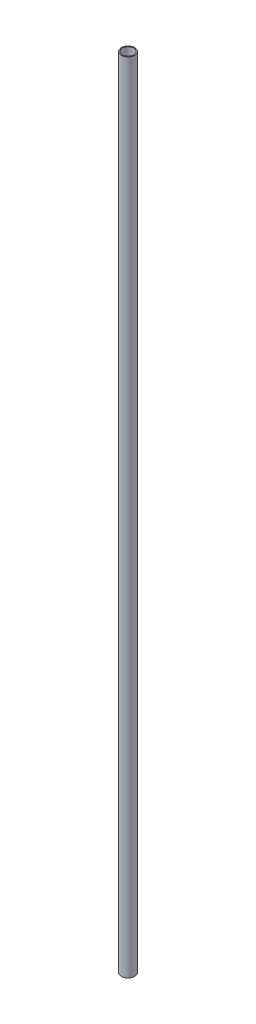
ISO-10303-21;
HEADER;
FILE_DESCRIPTION(('STEP AP214'),'2;1');
FILE_NAME('part.step','',(''),(''),'','','');
FILE_SCHEMA(('AUTOMOTIVE_DESIGN { 1 0 10303 214 1 1 1 1 }'));
ENDSEC;
DATA;
#1=APPLICATION_CONTEXT('core data for automotive mechanical design processes');
#2=APPLICATION_PROTOCOL_DEFINITION('international standard','automotive_design',2000,#1);
#3=PRODUCT_CONTEXT('',#1,'mechanical');
#4=PRODUCT('Part','Part','',(#3));
#5=PRODUCT_RELATED_PRODUCT_CATEGORY('part','',(#4));
#6=PRODUCT_DEFINITION_FORMATION('','',#4);
#7=PRODUCT_DEFINITION_CONTEXT('part definition',#1,'design');
#8=PRODUCT_DEFINITION('design','',#6,#7);
#9=PRODUCT_DEFINITION_SHAPE('','',#8);
#10=(LENGTH_UNIT() NAMED_UNIT(*) SI_UNIT(.MILLI.,.METRE.));
#11=(NAMED_UNIT(*) PLANE_ANGLE_UNIT() SI_UNIT($,.RADIAN.));
#12=(NAMED_UNIT(*) SI_UNIT($,.STERADIAN.) SOLID_ANGLE_UNIT());
#13=UNCERTAINTY_MEASURE_WITH_UNIT(LENGTH_MEASURE(1.E-05),#10,'distance_accuracy_value','');
#14=(GEOMETRIC_REPRESENTATION_CONTEXT(3) GLOBAL_UNCERTAINTY_ASSIGNED_CONTEXT((#13)) GLOBAL_UNIT_ASSIGNED_CONTEXT((#10,
#11,#12)) REPRESENTATION_CONTEXT('',''));
#15=CARTESIAN_POINT('',(0.,0.,0.));
#16=DIRECTION('',(0.,0.,1.));
#17=DIRECTION('',(1.,0.,0.));
#18=AXIS2_PLACEMENT_3D('',#15,#16,#17);
#19=CARTESIAN_POINT('',(0.,-890.,0.));
#20=DIRECTION('',(0.,1.,0.));
#21=DIRECTION('',(0.,0.,1.));
#22=AXIS2_PLACEMENT_3D('',#19,#20,#21);
#23=CYLINDRICAL_SURFACE('',#22,7.5);
#24=CARTESIAN_POINT('',(0.,-890.,0.));
#25=DIRECTION('',(0.,1.,0.));
#26=DIRECTION('',(0.,0.,1.));
#27=AXIS2_PLACEMENT_3D('',#24,#25,#26);
#28=CIRCLE('',#27,7.5);
#29=CARTESIAN_POINT('',(0.,-890.,7.5));
#30=VERTEX_POINT('',#29);
#31=EDGE_CURVE('E10',#30,#30,#28,.T.);
#32=ORIENTED_EDGE('',*,*,#31,.T.);
#33=EDGE_LOOP('',(#32));
#34=FACE_BOUND('',#33,.T.);
#35=CARTESIAN_POINT('',(0.,0.,0.));
#36=DIRECTION('',(0.,1.,0.));
#37=DIRECTION('',(0.,0.,1.));
#38=AXIS2_PLACEMENT_3D('',#35,#36,#37);
#39=CIRCLE('',#38,7.5);
#40=CARTESIAN_POINT('',(0.,0.,7.5));
#41=VERTEX_POINT('',#40);
#42=EDGE_CURVE('E44',#41,#41,#39,.T.);
#43=ORIENTED_EDGE('',*,*,#42,.F.);
#44=EDGE_LOOP('',(#43));
#45=FACE_BOUND('',#44,.T.);
#46=ADVANCED_FACE('F41',(#34,#45),#23,.T.);
#47=CARTESIAN_POINT('',(0.,-890.,0.));
#48=DIRECTION('',(0.,1.,0.));
#49=DIRECTION('',(0.,0.,1.));
#50=AXIS2_PLACEMENT_3D('',#47,#48,#49);
#51=PLANE('',#50);
#52=CARTESIAN_POINT('',(0.,-890.,0.));
#53=DIRECTION('',(0.,1.,0.));
#54=DIRECTION('',(0.,0.,1.));
#55=AXIS2_PLACEMENT_3D('',#52,#53,#54);
#56=CIRCLE('',#55,6.5);
#57=CARTESIAN_POINT('',(0.,-890.,6.5));
#58=VERTEX_POINT('',#57);
#59=EDGE_CURVE('E51',#58,#58,#56,.T.);
#60=ORIENTED_EDGE('',*,*,#59,.T.);
#61=EDGE_LOOP('',(#60));
#62=FACE_BOUND('',#61,.T.);
#63=ORIENTED_EDGE('',*,*,#31,.F.);
#64=EDGE_LOOP('',(#63));
#65=FACE_BOUND('',#64,.T.);
#66=ADVANCED_FACE('F59',(#62,#65),#51,.F.);
#67=CARTESIAN_POINT('',(0.,0.,0.));
#68=DIRECTION('',(0.,1.,0.));
#69=DIRECTION('',(0.,0.,1.));
#70=AXIS2_PLACEMENT_3D('',#67,#68,#69);
#71=PLANE('',#70);
#72=CARTESIAN_POINT('',(0.,0.,0.));
#73=DIRECTION('',(0.,1.,0.));
#74=DIRECTION('',(0.,0.,1.));
#75=AXIS2_PLACEMENT_3D('',#72,#73,#74);
#76=CIRCLE('',#75,6.5);
#77=CARTESIAN_POINT('',(0.,0.,6.5));
#78=VERTEX_POINT('',#77);
#79=EDGE_CURVE('E53',#78,#78,#76,.T.);
#80=ORIENTED_EDGE('',*,*,#79,.F.);
#81=EDGE_LOOP('',(#80));
#82=FACE_BOUND('',#81,.T.);
#83=ORIENTED_EDGE('',*,*,#42,.T.);
#84=EDGE_LOOP('',(#83));
#85=FACE_BOUND('',#84,.T.);
#86=ADVANCED_FACE('F65',(#82,#85),#71,.T.);
#87=CARTESIAN_POINT('',(0.,-890.,0.));
#88=DIRECTION('',(0.,1.,0.));
#89=DIRECTION('',(0.,0.,1.));
#90=AXIS2_PLACEMENT_3D('',#87,#88,#89);
#91=CYLINDRICAL_SURFACE('',#90,6.5);
#92=ORIENTED_EDGE('',*,*,#59,.F.);
#93=EDGE_LOOP('',(#92));
#94=FACE_BOUND('',#93,.T.);
#95=ORIENTED_EDGE('',*,*,#79,.T.);
#96=EDGE_LOOP('',(#95));
#97=FACE_BOUND('',#96,.T.);
#98=ADVANCED_FACE('F62',(#94,#97),#91,.F.);
#99=CLOSED_SHELL('',(#46,#66,#86,#98));
#100=MANIFOLD_SOLID_BREP('B2',#99);
#101=ADVANCED_BREP_SHAPE_REPRESENTATION('',(#18,#100),#14);
#102=SHAPE_DEFINITION_REPRESENTATION(#9,#101);
ENDSEC;
END-ISO-10303-21;
